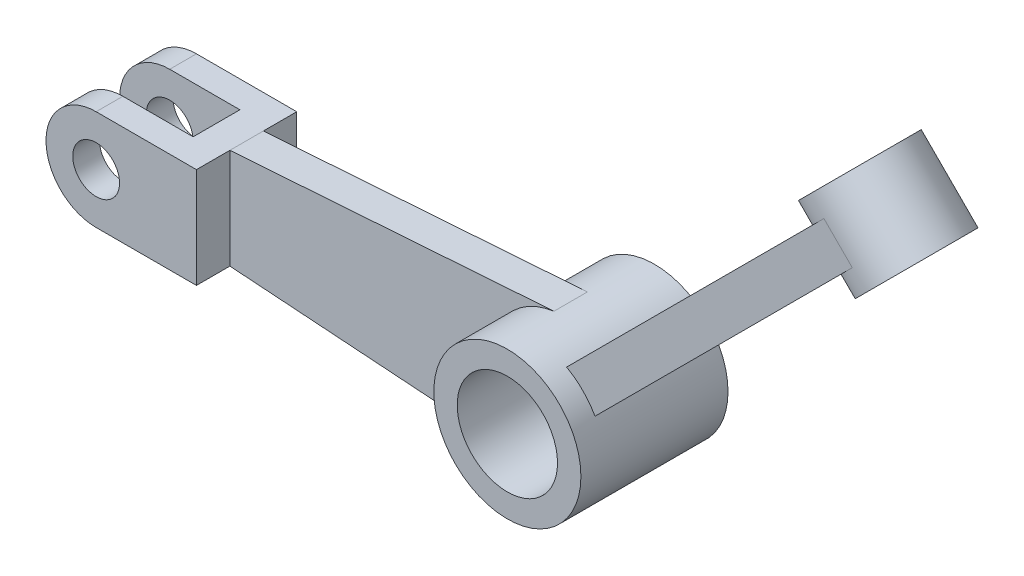
ISO-10303-21;
HEADER;
FILE_DESCRIPTION(('STEP AP214'),'2;1');
FILE_NAME('part.step','',(''),(''),'','','');
FILE_SCHEMA(('AUTOMOTIVE_DESIGN { 1 0 10303 214 1 1 1 1 }'));
ENDSEC;
DATA;
#1=APPLICATION_CONTEXT('core data for automotive mechanical design processes');
#2=APPLICATION_PROTOCOL_DEFINITION('international standard','automotive_design',2000,#1);
#3=PRODUCT_CONTEXT('',#1,'mechanical');
#4=PRODUCT('Part','Part','',(#3));
#5=PRODUCT_RELATED_PRODUCT_CATEGORY('part','',(#4));
#6=PRODUCT_DEFINITION_FORMATION('','',#4);
#7=PRODUCT_DEFINITION_CONTEXT('part definition',#1,'design');
#8=PRODUCT_DEFINITION('design','',#6,#7);
#9=PRODUCT_DEFINITION_SHAPE('','',#8);
#10=(LENGTH_UNIT() NAMED_UNIT(*) SI_UNIT(.MILLI.,.METRE.));
#11=(NAMED_UNIT(*) PLANE_ANGLE_UNIT() SI_UNIT($,.RADIAN.));
#12=(NAMED_UNIT(*) SI_UNIT($,.STERADIAN.) SOLID_ANGLE_UNIT());
#13=UNCERTAINTY_MEASURE_WITH_UNIT(LENGTH_MEASURE(1.E-05),#10,'distance_accuracy_value','');
#14=(GEOMETRIC_REPRESENTATION_CONTEXT(3) GLOBAL_UNCERTAINTY_ASSIGNED_CONTEXT((#13)) GLOBAL_UNIT_ASSIGNED_CONTEXT((#10,
#11,#12)) REPRESENTATION_CONTEXT('',''));
#15=CARTESIAN_POINT('',(0.,0.,0.));
#16=DIRECTION('',(0.,0.,1.));
#17=DIRECTION('',(1.,0.,0.));
#18=AXIS2_PLACEMENT_3D('',#15,#16,#17);
#19=CARTESIAN_POINT('',(-65.,0.,7.5));
#20=DIRECTION('',(0.,0.,-1.));
#21=DIRECTION('',(-1.,0.,0.));
#22=AXIS2_PLACEMENT_3D('',#19,#20,#21);
#23=CYLINDRICAL_SURFACE('',#22,7.5);
#24=DIRECTION('',(0.,0.,-1.));
#25=VECTOR('',#24,1.);
#26=CARTESIAN_POINT('',(-65.,-7.50000000000001,7.5));
#27=LINE('',#26,#25);
#28=CARTESIAN_POINT('',(-65.,-7.50000000000001,-3.5));
#29=VERTEX_POINT('',#28);
#30=CARTESIAN_POINT('',(-65.,-7.50000000000001,-7.5));
#31=VERTEX_POINT('',#30);
#32=EDGE_CURVE('E333',#29,#31,#27,.T.);
#33=ORIENTED_EDGE('',*,*,#32,.F.);
#34=CARTESIAN_POINT('',(-65.,0.,-3.5));
#35=DIRECTION('',(0.,0.,-1.));
#36=DIRECTION('',(-1.,0.,0.));
#37=AXIS2_PLACEMENT_3D('',#34,#35,#36);
#38=CIRCLE('',#37,7.5);
#39=CARTESIAN_POINT('',(-65.,7.49999999999999,-3.5));
#40=VERTEX_POINT('',#39);
#41=EDGE_CURVE('E200',#29,#40,#38,.T.);
#42=ORIENTED_EDGE('',*,*,#41,.T.);
#43=DIRECTION('',(0.,0.,-1.));
#44=VECTOR('',#43,1.);
#45=CARTESIAN_POINT('',(-65.,7.49999999999999,7.5));
#46=LINE('',#45,#44);
#47=CARTESIAN_POINT('',(-65.,7.49999999999999,-7.5));
#48=VERTEX_POINT('',#47);
#49=EDGE_CURVE('E305',#40,#48,#46,.T.);
#50=ORIENTED_EDGE('',*,*,#49,.T.);
#51=CARTESIAN_POINT('',(-65.,0.,-7.5));
#52=DIRECTION('',(0.,0.,1.));
#53=DIRECTION('',(1.,0.,0.));
#54=AXIS2_PLACEMENT_3D('',#51,#52,#53);
#55=CIRCLE('',#54,7.5);
#56=EDGE_CURVE('E287',#48,#31,#55,.T.);
#57=ORIENTED_EDGE('',*,*,#56,.T.);
#58=EDGE_LOOP('',(#33,#42,#50,#57));
#59=FACE_BOUND('',#58,.T.);
#60=ADVANCED_FACE('F41',(#59),#23,.T.);
#61=CARTESIAN_POINT('',(-50.,7.49999999999999,2.5));
#62=DIRECTION('',(-0.069829127699914,0.997558967141627,0.));
#63=DIRECTION('',(-0.997558967141627,-0.069829127699914,0.));
#64=AXIS2_PLACEMENT_3D('',#61,#62,#63);
#65=PLANE('',#64);
#66=DIRECTION('',(0.997558967141627,0.069829127699914,0.));
#67=VECTOR('',#66,1.);
#68=CARTESIAN_POINT('',(-50.,7.49999999999999,2.5));
#69=LINE('',#68,#67);
#70=CARTESIAN_POINT('',(-50.,7.49999999999999,2.5));
#71=VERTEX_POINT('',#70);
#72=CARTESIAN_POINT('',(-1.53249079510398,10.8927256443427,2.5));
#73=VERTEX_POINT('',#72);
#74=EDGE_CURVE('E270',#71,#73,#69,.T.);
#75=ORIENTED_EDGE('',*,*,#74,.T.);
#76=DIRECTION('',(0.,0.,-1.));
#77=VECTOR('',#76,1.);
#78=CARTESIAN_POINT('',(-1.53249079510398,10.8927256443427,11.));
#79=LINE('',#78,#77);
#80=CARTESIAN_POINT('',(-1.53249079510401,10.8927256443427,-2.5));
#81=VERTEX_POINT('',#80);
#82=EDGE_CURVE('E254',#73,#81,#79,.T.);
#83=ORIENTED_EDGE('',*,*,#82,.T.);
#84=DIRECTION('',(0.997558967141627,0.069829127699914,0.));
#85=VECTOR('',#84,1.);
#86=CARTESIAN_POINT('',(-50.,7.49999999999999,-2.5));
#87=LINE('',#86,#85);
#88=CARTESIAN_POINT('',(-50.,7.49999999999999,-2.5));
#89=VERTEX_POINT('',#88);
#90=EDGE_CURVE('E266',#89,#81,#87,.T.);
#91=ORIENTED_EDGE('',*,*,#90,.F.);
#92=DIRECTION('',(0.,0.,-1.));
#93=VECTOR('',#92,1.);
#94=CARTESIAN_POINT('',(-50.,7.49999999999999,2.5));
#95=LINE('',#94,#93);
#96=EDGE_CURVE('E283',#71,#89,#95,.T.);
#97=ORIENTED_EDGE('',*,*,#96,.F.);
#98=EDGE_LOOP('',(#75,#83,#91,#97));
#99=FACE_BOUND('',#98,.T.);
#100=ADVANCED_FACE('F397',(#99),#65,.T.);
#101=CARTESIAN_POINT('',(0.,-11.,2.5));
#102=DIRECTION('',(-0.0698291276999137,-0.997558967141627,0.));
#103=DIRECTION('',(0.997558967141627,-0.0698291276999137,0.));
#104=AXIS2_PLACEMENT_3D('',#101,#102,#103);
#105=PLANE('',#104);
#106=DIRECTION('',(-0.997558967141627,0.0698291276999137,0.));
#107=VECTOR('',#106,1.);
#108=CARTESIAN_POINT('',(0.,-11.,-2.5));
#109=LINE('',#108,#107);
#110=CARTESIAN_POINT('',(-1.532490795104,-10.8927256443427,-2.5));
#111=VERTEX_POINT('',#110);
#112=CARTESIAN_POINT('',(-50.,-7.50000000000001,-2.5));
#113=VERTEX_POINT('',#112);
#114=EDGE_CURVE('E261',#111,#113,#109,.T.);
#115=ORIENTED_EDGE('',*,*,#114,.F.);
#116=DIRECTION('',(0.,0.,-1.));
#117=VECTOR('',#116,1.);
#118=CARTESIAN_POINT('',(-1.53249079510395,-10.8927256443427,11.));
#119=LINE('',#118,#117);
#120=CARTESIAN_POINT('',(-1.53249079510395,-10.8927256443427,2.5));
#121=VERTEX_POINT('',#120);
#122=EDGE_CURVE('E247',#111,#121,#119,.F.);
#123=ORIENTED_EDGE('',*,*,#122,.T.);
#124=DIRECTION('',(-0.997558967141627,0.0698291276999137,0.));
#125=VECTOR('',#124,1.);
#126=CARTESIAN_POINT('',(0.,-11.,2.5));
#127=LINE('',#126,#125);
#128=CARTESIAN_POINT('',(-50.,-7.50000000000001,2.5));
#129=VERTEX_POINT('',#128);
#130=EDGE_CURVE('E262',#121,#129,#127,.T.);
#131=ORIENTED_EDGE('',*,*,#130,.T.);
#132=DIRECTION('',(0.,0.,-1.));
#133=VECTOR('',#132,1.);
#134=CARTESIAN_POINT('',(-50.,-7.50000000000001,2.5));
#135=LINE('',#134,#133);
#136=EDGE_CURVE('E274',#129,#113,#135,.T.);
#137=ORIENTED_EDGE('',*,*,#136,.T.);
#138=EDGE_LOOP('',(#115,#123,#131,#137));
#139=FACE_BOUND('',#138,.T.);
#140=ADVANCED_FACE('F402',(#139),#105,.T.);
#141=CARTESIAN_POINT('',(-50.,7.49999999999999,7.5));
#142=DIRECTION('',(-1.,0.,0.));
#143=DIRECTION('',(0.,-1.,0.));
#144=AXIS2_PLACEMENT_3D('',#141,#142,#143);
#145=PLANE('',#144);
#146=DIRECTION('',(0.,1.,0.));
#147=VECTOR('',#146,1.);
#148=CARTESIAN_POINT('',(-50.,-7.50000000000001,-2.5));
#149=LINE('',#148,#147);
#150=EDGE_CURVE('E277',#113,#89,#149,.T.);
#151=ORIENTED_EDGE('',*,*,#150,.F.);
#152=DIRECTION('',(0.,0.,-1.));
#153=VECTOR('',#152,1.);
#154=CARTESIAN_POINT('',(-50.,-7.50000000000001,7.5));
#155=LINE('',#154,#153);
#156=CARTESIAN_POINT('',(-50.,-7.50000000000001,-7.5));
#157=VERTEX_POINT('',#156);
#158=EDGE_CURVE('E328',#113,#157,#155,.T.);
#159=ORIENTED_EDGE('',*,*,#158,.T.);
#160=DIRECTION('',(0.,1.,0.));
#161=VECTOR('',#160,1.);
#162=CARTESIAN_POINT('',(-50.,7.49999999999999,-7.5));
#163=LINE('',#162,#161);
#164=CARTESIAN_POINT('',(-50.,7.49999999999999,-7.5));
#165=VERTEX_POINT('',#164);
#166=EDGE_CURVE('E313',#157,#165,#163,.T.);
#167=ORIENTED_EDGE('',*,*,#166,.T.);
#168=DIRECTION('',(0.,0.,-1.));
#169=VECTOR('',#168,1.);
#170=CARTESIAN_POINT('',(-50.,7.49999999999999,7.5));
#171=LINE('',#170,#169);
#172=EDGE_CURVE('E323',#89,#165,#171,.T.);
#173=ORIENTED_EDGE('',*,*,#172,.F.);
#174=EDGE_LOOP('',(#151,#159,#167,#173));
#175=FACE_BOUND('',#174,.T.);
#176=ADVANCED_FACE('F408',(#175),#145,.F.);
#177=CARTESIAN_POINT('',(-65.,7.49999999999999,7.5));
#178=VERTEX_POINT('',#177);
#179=CARTESIAN_POINT('',(-65.,7.49999999999999,3.5));
#180=VERTEX_POINT('',#179);
#181=EDGE_CURVE('E320',#178,#180,#46,.T.);
#182=ORIENTED_EDGE('',*,*,#181,.T.);
#183=CARTESIAN_POINT('',(-65.,0.,3.5));
#184=DIRECTION('',(0.,0.,1.));
#185=DIRECTION('',(1.,0.,0.));
#186=AXIS2_PLACEMENT_3D('',#183,#184,#185);
#187=CIRCLE('',#186,7.5);
#188=CARTESIAN_POINT('',(-65.,-7.50000000000001,3.5));
#189=VERTEX_POINT('',#188);
#190=EDGE_CURVE('E59',#180,#189,#187,.T.);
#191=ORIENTED_EDGE('',*,*,#190,.T.);
#192=CARTESIAN_POINT('',(-65.,-7.50000000000001,7.5));
#193=VERTEX_POINT('',#192);
#194=EDGE_CURVE('E334',#193,#189,#27,.T.);
#195=ORIENTED_EDGE('',*,*,#194,.F.);
#196=CARTESIAN_POINT('',(-65.,0.,7.5));
#197=DIRECTION('',(0.,0.,1.));
#198=DIRECTION('',(1.,0.,0.));
#199=AXIS2_PLACEMENT_3D('',#196,#197,#198);
#200=CIRCLE('',#199,7.5);
#201=EDGE_CURVE('E291',#178,#193,#200,.T.);
#202=ORIENTED_EDGE('',*,*,#201,.F.);
#203=EDGE_LOOP('',(#182,#191,#195,#202));
#204=FACE_BOUND('',#203,.T.);
#205=ADVANCED_FACE('F43',(#204),#23,.T.);
#206=CARTESIAN_POINT('',(-65.,-7.50000000000001,7.5));
#207=DIRECTION('',(0.,1.,0.));
#208=DIRECTION('',(0.,0.,1.));
#209=AXIS2_PLACEMENT_3D('',#206,#207,#208);
#210=PLANE('',#209);
#211=DIRECTION('',(0.,0.,-1.));
#212=VECTOR('',#211,1.);
#213=CARTESIAN_POINT('',(-54.5,-7.50000000000001,7.5));
#214=LINE('',#213,#212);
#215=CARTESIAN_POINT('',(-54.5,-7.50000000000001,3.5));
#216=VERTEX_POINT('',#215);
#217=CARTESIAN_POINT('',(-54.5,-7.50000000000001,-3.5));
#218=VERTEX_POINT('',#217);
#219=EDGE_CURVE('E164',#216,#218,#214,.T.);
#220=ORIENTED_EDGE('',*,*,#219,.T.);
#221=DIRECTION('',(-1.,0.,0.));
#222=VECTOR('',#221,1.);
#223=CARTESIAN_POINT('',(-65.,-7.50000000000001,-3.5));
#224=LINE('',#223,#222);
#225=EDGE_CURVE('E196',#218,#29,#224,.T.);
#226=ORIENTED_EDGE('',*,*,#225,.T.);
#227=ORIENTED_EDGE('',*,*,#32,.T.);
#228=DIRECTION('',(1.,0.,0.));
#229=VECTOR('',#228,1.);
#230=CARTESIAN_POINT('',(-65.,-7.50000000000001,-7.5));
#231=LINE('',#230,#229);
#232=EDGE_CURVE('E309',#31,#157,#231,.T.);
#233=ORIENTED_EDGE('',*,*,#232,.T.);
#234=ORIENTED_EDGE('',*,*,#158,.F.);
#235=ORIENTED_EDGE('',*,*,#136,.F.);
#236=CARTESIAN_POINT('',(-50.,-7.50000000000001,7.5));
#237=VERTEX_POINT('',#236);
#238=EDGE_CURVE('E329',#237,#129,#155,.T.);
#239=ORIENTED_EDGE('',*,*,#238,.F.);
#240=DIRECTION('',(1.,0.,0.));
#241=VECTOR('',#240,1.);
#242=CARTESIAN_POINT('',(-65.,-7.50000000000001,7.5));
#243=LINE('',#242,#241);
#244=EDGE_CURVE('E295',#193,#237,#243,.T.);
#245=ORIENTED_EDGE('',*,*,#244,.F.);
#246=ORIENTED_EDGE('',*,*,#194,.T.);
#247=DIRECTION('',(1.,0.,0.));
#248=VECTOR('',#247,1.);
#249=CARTESIAN_POINT('',(-65.,-7.50000000000001,3.5));
#250=LINE('',#249,#248);
#251=EDGE_CURVE('E188',#189,#216,#250,.T.);
#252=ORIENTED_EDGE('',*,*,#251,.T.);
#253=EDGE_LOOP('',(#220,#226,#227,#233,#234,#235,#239,#245,#246,#252));
#254=FACE_BOUND('',#253,.T.);
#255=ADVANCED_FACE('F407',(#254),#210,.F.);
#256=ORIENTED_EDGE('',*,*,#238,.T.);
#257=DIRECTION('',(0.,1.,0.));
#258=VECTOR('',#257,1.);
#259=CARTESIAN_POINT('',(-50.,-7.50000000000001,2.5));
#260=LINE('',#259,#258);
#261=EDGE_CURVE('E265',#129,#71,#260,.T.);
#262=ORIENTED_EDGE('',*,*,#261,.T.);
#263=CARTESIAN_POINT('',(-50.,7.49999999999999,7.5));
#264=VERTEX_POINT('',#263);
#265=EDGE_CURVE('E324',#264,#71,#171,.T.);
#266=ORIENTED_EDGE('',*,*,#265,.F.);
#267=DIRECTION('',(0.,1.,0.));
#268=VECTOR('',#267,1.);
#269=CARTESIAN_POINT('',(-50.,7.49999999999999,7.5));
#270=LINE('',#269,#268);
#271=EDGE_CURVE('E299',#237,#264,#270,.T.);
#272=ORIENTED_EDGE('',*,*,#271,.F.);
#273=EDGE_LOOP('',(#256,#262,#266,#272));
#274=FACE_BOUND('',#273,.T.);
#275=ADVANCED_FACE('F414',(#274),#145,.F.);
#276=CARTESIAN_POINT('',(-65.,7.49999999999999,7.5));
#277=DIRECTION('',(0.,-1.,0.));
#278=DIRECTION('',(0.,0.,-1.));
#279=AXIS2_PLACEMENT_3D('',#276,#277,#278);
#280=PLANE('',#279);
#281=ORIENTED_EDGE('',*,*,#49,.F.);
#282=DIRECTION('',(-1.,0.,0.));
#283=VECTOR('',#282,1.);
#284=CARTESIAN_POINT('',(-54.5,7.49999999999999,-3.5));
#285=LINE('',#284,#283);
#286=CARTESIAN_POINT('',(-54.5,7.49999999999999,-3.5));
#287=VERTEX_POINT('',#286);
#288=EDGE_CURVE('E168',#287,#40,#285,.T.);
#289=ORIENTED_EDGE('',*,*,#288,.F.);
#290=DIRECTION('',(0.,0.,-1.));
#291=VECTOR('',#290,1.);
#292=CARTESIAN_POINT('',(-54.5,7.49999999999999,-3.5));
#293=LINE('',#292,#291);
#294=CARTESIAN_POINT('',(-54.5,7.49999999999999,3.5));
#295=VERTEX_POINT('',#294);
#296=EDGE_CURVE('E161',#295,#287,#293,.T.);
#297=ORIENTED_EDGE('',*,*,#296,.F.);
#298=DIRECTION('',(-1.,0.,0.));
#299=VECTOR('',#298,1.);
#300=CARTESIAN_POINT('',(-65.,7.49999999999999,3.5));
#301=LINE('',#300,#299);
#302=EDGE_CURVE('E11',#295,#180,#301,.T.);
#303=ORIENTED_EDGE('',*,*,#302,.T.);
#304=ORIENTED_EDGE('',*,*,#181,.F.);
#305=DIRECTION('',(-1.,0.,0.));
#306=VECTOR('',#305,1.);
#307=CARTESIAN_POINT('',(-65.,7.49999999999999,7.5));
#308=LINE('',#307,#306);
#309=EDGE_CURVE('E302',#264,#178,#308,.T.);
#310=ORIENTED_EDGE('',*,*,#309,.F.);
#311=ORIENTED_EDGE('',*,*,#265,.T.);
#312=ORIENTED_EDGE('',*,*,#96,.T.);
#313=ORIENTED_EDGE('',*,*,#172,.T.);
#314=DIRECTION('',(-1.,0.,0.));
#315=VECTOR('',#314,1.);
#316=CARTESIAN_POINT('',(-65.,7.49999999999999,-7.5));
#317=LINE('',#316,#315);
#318=EDGE_CURVE('E296',#165,#48,#317,.T.);
#319=ORIENTED_EDGE('',*,*,#318,.T.);
#320=EDGE_LOOP('',(#281,#289,#297,#303,#304,#310,#311,#312,#313,#319));
#321=FACE_BOUND('',#320,.T.);
#322=ADVANCED_FACE('F175',(#321),#280,.F.);
#323=CARTESIAN_POINT('',(-65.,0.,7.5));
#324=DIRECTION('',(0.,0.,1.));
#325=DIRECTION('',(1.,0.,0.));
#326=AXIS2_PLACEMENT_3D('',#323,#324,#325);
#327=PLANE('',#326);
#328=CARTESIAN_POINT('',(-65.,0.,7.5));
#329=DIRECTION('',(0.,0.,1.));
#330=DIRECTION('',(1.,0.,0.));
#331=AXIS2_PLACEMENT_3D('',#328,#329,#330);
#332=CIRCLE('',#331,3.5);
#333=CARTESIAN_POINT('',(-61.5,0.,7.5));
#334=VERTEX_POINT('',#333);
#335=EDGE_CURVE('E177',#334,#334,#332,.T.);
#336=ORIENTED_EDGE('',*,*,#335,.F.);
#337=EDGE_LOOP('',(#336));
#338=FACE_BOUND('',#337,.T.);
#339=ORIENTED_EDGE('',*,*,#201,.T.);
#340=ORIENTED_EDGE('',*,*,#244,.T.);
#341=ORIENTED_EDGE('',*,*,#271,.T.);
#342=ORIENTED_EDGE('',*,*,#309,.T.);
#343=EDGE_LOOP('',(#339,#340,#341,#342));
#344=FACE_BOUND('',#343,.T.);
#345=ADVANCED_FACE('F423',(#338,#344),#327,.T.);
#346=CARTESIAN_POINT('',(-65.,0.,-7.5));
#347=DIRECTION('',(0.,0.,1.));
#348=DIRECTION('',(1.,0.,0.));
#349=AXIS2_PLACEMENT_3D('',#346,#347,#348);
#350=PLANE('',#349);
#351=CARTESIAN_POINT('',(-65.,0.,-7.5));
#352=DIRECTION('',(0.,0.,1.));
#353=DIRECTION('',(1.,0.,0.));
#354=AXIS2_PLACEMENT_3D('',#351,#352,#353);
#355=CIRCLE('',#354,3.5);
#356=CARTESIAN_POINT('',(-61.5,0.,-7.5));
#357=VERTEX_POINT('',#356);
#358=EDGE_CURVE('E183',#357,#357,#355,.T.);
#359=ORIENTED_EDGE('',*,*,#358,.T.);
#360=EDGE_LOOP('',(#359));
#361=FACE_BOUND('',#360,.T.);
#362=ORIENTED_EDGE('',*,*,#56,.F.);
#363=ORIENTED_EDGE('',*,*,#318,.F.);
#364=ORIENTED_EDGE('',*,*,#166,.F.);
#365=ORIENTED_EDGE('',*,*,#232,.F.);
#366=EDGE_LOOP('',(#362,#363,#364,#365));
#367=FACE_BOUND('',#366,.T.);
#368=ADVANCED_FACE('F377',(#361,#367),#350,.F.);
#369=CARTESIAN_POINT('',(0.,0.,2.5));
#370=DIRECTION('',(0.,0.,-1.));
#371=DIRECTION('',(-1.,0.,0.));
#372=AXIS2_PLACEMENT_3D('',#369,#370,#371);
#373=PLANE('',#372);
#374=CARTESIAN_POINT('',(0.,0.,2.5));
#375=DIRECTION('',(0.,0.,-1.));
#376=DIRECTION('',(-1.,0.,0.));
#377=AXIS2_PLACEMENT_3D('',#374,#375,#376);
#378=CIRCLE('',#377,11.);
#379=EDGE_CURVE('E258',#73,#121,#378,.F.);
#380=ORIENTED_EDGE('',*,*,#379,.F.);
#381=ORIENTED_EDGE('',*,*,#74,.F.);
#382=ORIENTED_EDGE('',*,*,#261,.F.);
#383=ORIENTED_EDGE('',*,*,#130,.F.);
#384=EDGE_LOOP('',(#380,#381,#382,#383));
#385=FACE_BOUND('',#384,.T.);
#386=ADVANCED_FACE('F432',(#385),#373,.F.);
#387=CARTESIAN_POINT('',(0.,0.,-2.5));
#388=DIRECTION('',(0.,0.,-1.));
#389=DIRECTION('',(-1.,0.,0.));
#390=AXIS2_PLACEMENT_3D('',#387,#388,#389);
#391=PLANE('',#390);
#392=ORIENTED_EDGE('',*,*,#90,.T.);
#393=CARTESIAN_POINT('',(0.,0.,-2.5));
#394=DIRECTION('',(0.,0.,-1.));
#395=DIRECTION('',(-1.,0.,0.));
#396=AXIS2_PLACEMENT_3D('',#393,#394,#395);
#397=CIRCLE('',#396,11.);
#398=EDGE_CURVE('E338',#81,#111,#397,.F.);
#399=ORIENTED_EDGE('',*,*,#398,.T.);
#400=ORIENTED_EDGE('',*,*,#114,.T.);
#401=ORIENTED_EDGE('',*,*,#150,.T.);
#402=EDGE_LOOP('',(#392,#399,#400,#401));
#403=FACE_BOUND('',#402,.T.);
#404=ADVANCED_FACE('F441',(#403),#391,.T.);
#405=CARTESIAN_POINT('',(0.,0.,11.));
#406=DIRECTION('',(0.,0.,-1.));
#407=DIRECTION('',(-1.,0.,0.));
#408=AXIS2_PLACEMENT_3D('',#405,#406,#407);
#409=CYLINDRICAL_SURFACE('',#408,11.);
#410=DIRECTION('',(0.,0.,-1.));
#411=VECTOR('',#410,1.);
#412=CARTESIAN_POINT('',(9.60463511710751,5.36199442998826,11.));
#413=LINE('',#412,#411);
#414=CARTESIAN_POINT('',(9.60463511710751,5.36199442998826,7.5));
#415=VERTEX_POINT('',#414);
#416=CARTESIAN_POINT('',(9.60463511710751,5.36199442998826,-7.5));
#417=VERTEX_POINT('',#416);
#418=EDGE_CURVE('E66',#415,#417,#413,.T.);
#419=ORIENTED_EDGE('',*,*,#418,.F.);
#420=CARTESIAN_POINT('',(0.,0.,7.5));
#421=DIRECTION('',(0.,0.,1.));
#422=DIRECTION('',(1.,0.,0.));
#423=AXIS2_PLACEMENT_3D('',#420,#421,#422);
#424=CIRCLE('',#423,11.);
#425=CARTESIAN_POINT('',(5.36199442998822,9.60463511710754,7.5));
#426=VERTEX_POINT('',#425);
#427=EDGE_CURVE('E51',#415,#426,#424,.T.);
#428=ORIENTED_EDGE('',*,*,#427,.T.);
#429=DIRECTION('',(0.,0.,-1.));
#430=VECTOR('',#429,1.);
#431=CARTESIAN_POINT('',(5.36199442998822,9.60463511710754,11.));
#432=LINE('',#431,#430);
#433=CARTESIAN_POINT('',(5.36199442998822,9.60463511710754,-7.5));
#434=VERTEX_POINT('',#433);
#435=EDGE_CURVE('E346',#434,#426,#432,.F.);
#436=ORIENTED_EDGE('',*,*,#435,.F.);
#437=CARTESIAN_POINT('',(0.,0.,-7.5));
#438=DIRECTION('',(0.,0.,1.));
#439=DIRECTION('',(1.,0.,0.));
#440=AXIS2_PLACEMENT_3D('',#437,#438,#439);
#441=CIRCLE('',#440,11.);
#442=EDGE_CURVE('E342',#417,#434,#441,.T.);
#443=ORIENTED_EDGE('',*,*,#442,.F.);
#444=EDGE_LOOP('',(#419,#428,#436,#443));
#445=FACE_BOUND('',#444,.T.);
#446=CARTESIAN_POINT('',(0.,0.,11.));
#447=DIRECTION('',(0.,0.,1.));
#448=DIRECTION('',(1.,0.,0.));
#449=AXIS2_PLACEMENT_3D('',#446,#447,#448);
#450=CIRCLE('',#449,11.);
#451=CARTESIAN_POINT('',(11.,0.,11.));
#452=VERTEX_POINT('',#451);
#453=EDGE_CURVE('E243',#452,#452,#450,.T.);
#454=ORIENTED_EDGE('',*,*,#453,.F.);
#455=EDGE_LOOP('',(#454));
#456=FACE_BOUND('',#455,.T.);
#457=CARTESIAN_POINT('',(0.,0.,-11.));
#458=DIRECTION('',(0.,0.,1.));
#459=DIRECTION('',(1.,0.,0.));
#460=AXIS2_PLACEMENT_3D('',#457,#458,#459);
#461=CIRCLE('',#460,11.);
#462=CARTESIAN_POINT('',(11.,0.,-11.));
#463=VERTEX_POINT('',#462);
#464=EDGE_CURVE('E233',#463,#463,#461,.T.);
#465=ORIENTED_EDGE('',*,*,#464,.T.);
#466=EDGE_LOOP('',(#465));
#467=FACE_BOUND('',#466,.T.);
#468=ORIENTED_EDGE('',*,*,#82,.F.);
#469=ORIENTED_EDGE('',*,*,#379,.T.);
#470=ORIENTED_EDGE('',*,*,#122,.F.);
#471=ORIENTED_EDGE('',*,*,#398,.F.);
#472=EDGE_LOOP('',(#468,#469,#470,#471));
#473=FACE_BOUND('',#472,.T.);
#474=ADVANCED_FACE('F443',(#445,#456,#467,#473),#409,.T.);
#475=CARTESIAN_POINT('',(0.,0.,11.));
#476=DIRECTION('',(0.,0.,1.));
#477=DIRECTION('',(1.,0.,0.));
#478=AXIS2_PLACEMENT_3D('',#475,#476,#477);
#479=PLANE('',#478);
#480=CARTESIAN_POINT('',(0.,0.,11.));
#481=DIRECTION('',(0.,0.,1.));
#482=DIRECTION('',(1.,0.,0.));
#483=AXIS2_PLACEMENT_3D('',#480,#481,#482);
#484=CIRCLE('',#483,7.5);
#485=CARTESIAN_POINT('',(7.5,0.,11.));
#486=VERTEX_POINT('',#485);
#487=EDGE_CURVE('E365',#486,#486,#484,.T.);
#488=ORIENTED_EDGE('',*,*,#487,.F.);
#489=EDGE_LOOP('',(#488));
#490=FACE_BOUND('',#489,.T.);
#491=ORIENTED_EDGE('',*,*,#453,.T.);
#492=EDGE_LOOP('',(#491));
#493=FACE_BOUND('',#492,.T.);
#494=ADVANCED_FACE('F445',(#490,#493),#479,.T.);
#495=CARTESIAN_POINT('',(0.,0.,-11.));
#496=DIRECTION('',(0.,0.,1.));
#497=DIRECTION('',(1.,0.,0.));
#498=AXIS2_PLACEMENT_3D('',#495,#496,#497);
#499=PLANE('',#498);
#500=CARTESIAN_POINT('',(0.,0.,-11.));
#501=DIRECTION('',(0.,0.,1.));
#502=DIRECTION('',(1.,0.,0.));
#503=AXIS2_PLACEMENT_3D('',#500,#501,#502);
#504=CIRCLE('',#503,7.5);
#505=CARTESIAN_POINT('',(7.5,0.,-11.));
#506=VERTEX_POINT('',#505);
#507=EDGE_CURVE('E357',#506,#506,#504,.T.);
#508=ORIENTED_EDGE('',*,*,#507,.T.);
#509=EDGE_LOOP('',(#508));
#510=FACE_BOUND('',#509,.T.);
#511=ORIENTED_EDGE('',*,*,#464,.F.);
#512=EDGE_LOOP('',(#511));
#513=FACE_BOUND('',#512,.T.);
#514=ADVANCED_FACE('F451',(#510,#513),#499,.F.);
#515=CARTESIAN_POINT('',(2.12132034355965,-2.12132034355964,7.5));
#516=DIRECTION('',(-0.707106781186549,0.707106781186546,0.));
#517=DIRECTION('',(-0.707106781186546,-0.707106781186549,0.));
#518=AXIS2_PLACEMENT_3D('',#515,#516,#517);
#519=PLANE('',#518);
#520=CARTESIAN_POINT('',(48.0832611206852,43.840620433566,0.));
#521=DIRECTION('',(-0.707106781186549,0.707106781186546,0.));
#522=DIRECTION('',(-0.707106781186546,-0.707106781186549,0.));
#523=AXIS2_PLACEMENT_3D('',#520,#521,#522);
#524=CIRCLE('',#523,7.5);
#525=CARTESIAN_POINT('',(48.0832611206852,43.840620433566,7.5));
#526=VERTEX_POINT('',#525);
#527=CARTESIAN_POINT('',(48.0832611206852,43.840620433566,-7.5));
#528=VERTEX_POINT('',#527);
#529=EDGE_CURVE('E216',#526,#528,#524,.F.);
#530=ORIENTED_EDGE('',*,*,#529,.F.);
#531=DIRECTION('',(0.707106781186546,0.707106781186549,0.));
#532=VECTOR('',#531,1.);
#533=CARTESIAN_POINT('',(2.12132034355965,-2.12132034355964,7.5));
#534=LINE('',#533,#532);
#535=EDGE_CURVE('E221',#415,#526,#534,.T.);
#536=ORIENTED_EDGE('',*,*,#535,.F.);
#537=ORIENTED_EDGE('',*,*,#418,.T.);
#538=DIRECTION('',(0.707106781186546,0.707106781186549,0.));
#539=VECTOR('',#538,1.);
#540=CARTESIAN_POINT('',(2.12132034355965,-2.12132034355964,-7.5));
#541=LINE('',#540,#539);
#542=EDGE_CURVE('E220',#417,#528,#541,.T.);
#543=ORIENTED_EDGE('',*,*,#542,.T.);
#544=EDGE_LOOP('',(#530,#536,#537,#543));
#545=FACE_BOUND('',#544,.T.);
#546=ADVANCED_FACE('F508',(#545),#519,.F.);
#547=CARTESIAN_POINT('',(-2.12132034355965,2.12132034355964,7.5));
#548=DIRECTION('',(0.707106781186549,-0.707106781186546,0.));
#549=DIRECTION('',(0.707106781186546,0.707106781186549,0.));
#550=AXIS2_PLACEMENT_3D('',#547,#548,#549);
#551=PLANE('',#550);
#552=CARTESIAN_POINT('',(43.8406204335659,48.0832611206853,0.));
#553=DIRECTION('',(0.707106781186549,-0.707106781186546,0.));
#554=DIRECTION('',(0.707106781186546,0.707106781186549,0.));
#555=AXIS2_PLACEMENT_3D('',#552,#553,#554);
#556=CIRCLE('',#555,7.5);
#557=CARTESIAN_POINT('',(43.8406204335659,48.0832611206853,-7.5));
#558=VERTEX_POINT('',#557);
#559=CARTESIAN_POINT('',(43.8406204335659,48.0832611206853,7.5));
#560=VERTEX_POINT('',#559);
#561=EDGE_CURVE('E209',#558,#560,#556,.F.);
#562=ORIENTED_EDGE('',*,*,#561,.F.);
#563=DIRECTION('',(-0.707106781186546,-0.707106781186549,0.));
#564=VECTOR('',#563,1.);
#565=CARTESIAN_POINT('',(-2.12132034355965,2.12132034355964,-7.5));
#566=LINE('',#565,#564);
#567=EDGE_CURVE('E226',#558,#434,#566,.T.);
#568=ORIENTED_EDGE('',*,*,#567,.T.);
#569=ORIENTED_EDGE('',*,*,#435,.T.);
#570=DIRECTION('',(-0.707106781186546,-0.707106781186549,0.));
#571=VECTOR('',#570,1.);
#572=CARTESIAN_POINT('',(-2.12132034355965,2.12132034355964,7.5));
#573=LINE('',#572,#571);
#574=EDGE_CURVE('E229',#560,#426,#573,.T.);
#575=ORIENTED_EDGE('',*,*,#574,.F.);
#576=EDGE_LOOP('',(#562,#568,#569,#575));
#577=FACE_BOUND('',#576,.T.);
#578=ADVANCED_FACE('F512',(#577),#551,.F.);
#579=CARTESIAN_POINT('',(0.,0.,7.5));
#580=DIRECTION('',(0.,0.,1.));
#581=DIRECTION('',(1.,0.,0.));
#582=AXIS2_PLACEMENT_3D('',#579,#580,#581);
#583=PLANE('',#582);
#584=ORIENTED_EDGE('',*,*,#427,.F.);
#585=ORIENTED_EDGE('',*,*,#535,.T.);
#586=DIRECTION('',(-0.707106781186549,0.707106781186546,0.));
#587=VECTOR('',#586,1.);
#588=CARTESIAN_POINT('',(43.8406204335659,48.0832611206853,7.5));
#589=LINE('',#588,#587);
#590=EDGE_CURVE('E225',#526,#560,#589,.T.);
#591=ORIENTED_EDGE('',*,*,#590,.T.);
#592=ORIENTED_EDGE('',*,*,#574,.T.);
#593=EDGE_LOOP('',(#584,#585,#591,#592));
#594=FACE_BOUND('',#593,.T.);
#595=ADVANCED_FACE('F523',(#594),#583,.T.);
#596=CARTESIAN_POINT('',(0.,0.,-7.5));
#597=DIRECTION('',(0.,0.,1.));
#598=DIRECTION('',(1.,0.,0.));
#599=AXIS2_PLACEMENT_3D('',#596,#597,#598);
#600=PLANE('',#599);
#601=ORIENTED_EDGE('',*,*,#542,.F.);
#602=ORIENTED_EDGE('',*,*,#442,.T.);
#603=ORIENTED_EDGE('',*,*,#567,.F.);
#604=DIRECTION('',(-0.707106781186549,0.707106781186546,0.));
#605=VECTOR('',#604,1.);
#606=CARTESIAN_POINT('',(43.8406204335659,48.0832611206853,-7.5));
#607=LINE('',#606,#605);
#608=EDGE_CURVE('E236',#528,#558,#607,.T.);
#609=ORIENTED_EDGE('',*,*,#608,.F.);
#610=EDGE_LOOP('',(#601,#602,#603,#609));
#611=FACE_BOUND('',#610,.T.);
#612=ADVANCED_FACE('F533',(#611),#600,.F.);
#613=CARTESIAN_POINT('',(41.7193000900062,50.204581464245,0.));
#614=DIRECTION('',(0.707106781186549,-0.707106781186546,0.));
#615=DIRECTION('',(0.707106781186546,0.707106781186549,0.));
#616=AXIS2_PLACEMENT_3D('',#613,#614,#615);
#617=CYLINDRICAL_SURFACE('',#616,7.5);
#618=ORIENTED_EDGE('',*,*,#590,.F.);
#619=ORIENTED_EDGE('',*,*,#529,.T.);
#620=ORIENTED_EDGE('',*,*,#608,.T.);
#621=ORIENTED_EDGE('',*,*,#561,.T.);
#622=EDGE_LOOP('',(#618,#619,#620,#621));
#623=FACE_BOUND('',#622,.T.);
#624=CARTESIAN_POINT('',(41.7193000900062,50.204581464245,0.));
#625=DIRECTION('',(-0.707106781186549,0.707106781186546,0.));
#626=DIRECTION('',(-0.707106781186546,-0.707106781186549,0.));
#627=AXIS2_PLACEMENT_3D('',#624,#625,#626);
#628=CIRCLE('',#627,7.5);
#629=CARTESIAN_POINT('',(36.4159992311071,44.9012806053458,0.));
#630=VERTEX_POINT('',#629);
#631=EDGE_CURVE('E205',#630,#630,#628,.T.);
#632=ORIENTED_EDGE('',*,*,#631,.F.);
#633=EDGE_LOOP('',(#632));
#634=FACE_BOUND('',#633,.T.);
#635=CARTESIAN_POINT('',(50.2045814642448,41.7193000900064,0.));
#636=DIRECTION('',(-0.707106781186549,0.707106781186546,0.));
#637=DIRECTION('',(-0.707106781186546,-0.707106781186549,0.));
#638=AXIS2_PLACEMENT_3D('',#635,#636,#637);
#639=CIRCLE('',#638,7.5);
#640=CARTESIAN_POINT('',(44.9012806053457,36.4159992311073,0.));
#641=VERTEX_POINT('',#640);
#642=EDGE_CURVE('E204',#641,#641,#639,.T.);
#643=ORIENTED_EDGE('',*,*,#642,.T.);
#644=EDGE_LOOP('',(#643));
#645=FACE_BOUND('',#644,.T.);
#646=ADVANCED_FACE('F543',(#623,#634,#645),#617,.T.);
#647=CARTESIAN_POINT('',(41.7193000900062,50.204581464245,0.));
#648=DIRECTION('',(-0.707106781186549,0.707106781186546,0.));
#649=DIRECTION('',(-0.707106781186546,-0.707106781186549,0.));
#650=AXIS2_PLACEMENT_3D('',#647,#648,#649);
#651=PLANE('',#650);
#652=CARTESIAN_POINT('',(41.7193000900062,50.204581464245,0.));
#653=DIRECTION('',(-0.707106781186549,0.707106781186546,0.));
#654=DIRECTION('',(-0.707106781186546,-0.707106781186549,0.));
#655=AXIS2_PLACEMENT_3D('',#652,#653,#654);
#656=CIRCLE('',#655,3.5);
#657=CARTESIAN_POINT('',(39.2444263558533,47.729707730092,0.));
#658=VERTEX_POINT('',#657);
#659=EDGE_CURVE('E657',#658,#658,#656,.T.);
#660=ORIENTED_EDGE('',*,*,#659,.F.);
#661=EDGE_LOOP('',(#660));
#662=FACE_BOUND('',#661,.T.);
#663=ORIENTED_EDGE('',*,*,#631,.T.);
#664=EDGE_LOOP('',(#663));
#665=FACE_BOUND('',#664,.T.);
#666=ADVANCED_FACE('F552',(#662,#665),#651,.T.);
#667=CARTESIAN_POINT('',(50.2045814642448,41.7193000900064,0.));
#668=DIRECTION('',(-0.707106781186549,0.707106781186546,0.));
#669=DIRECTION('',(-0.707106781186546,-0.707106781186549,0.));
#670=AXIS2_PLACEMENT_3D('',#667,#668,#669);
#671=PLANE('',#670);
#672=CARTESIAN_POINT('',(50.2045814642448,41.7193000900064,0.));
#673=DIRECTION('',(-0.707106781186549,0.707106781186546,0.));
#674=DIRECTION('',(-0.707106781186546,-0.707106781186549,0.));
#675=AXIS2_PLACEMENT_3D('',#672,#673,#674);
#676=CIRCLE('',#675,3.5);
#677=CARTESIAN_POINT('',(47.7297077300919,39.2444263558535,0.));
#678=VERTEX_POINT('',#677);
#679=EDGE_CURVE('E45',#678,#678,#676,.T.);
#680=ORIENTED_EDGE('',*,*,#679,.T.);
#681=EDGE_LOOP('',(#680));
#682=FACE_BOUND('',#681,.T.);
#683=ORIENTED_EDGE('',*,*,#642,.F.);
#684=EDGE_LOOP('',(#683));
#685=FACE_BOUND('',#684,.T.);
#686=ADVANCED_FACE('F633',(#682,#685),#671,.F.);
#687=CARTESIAN_POINT('',(-54.5,-11.,-3.5));
#688=DIRECTION('',(0.,0.,-1.));
#689=DIRECTION('',(-1.,0.,0.));
#690=AXIS2_PLACEMENT_3D('',#687,#688,#689);
#691=PLANE('',#690);
#692=CARTESIAN_POINT('',(-65.,0.,-3.5));
#693=DIRECTION('',(0.,0.,-1.));
#694=DIRECTION('',(-1.,0.,0.));
#695=AXIS2_PLACEMENT_3D('',#692,#693,#694);
#696=CIRCLE('',#695,3.5);
#697=CARTESIAN_POINT('',(-68.5,0.,-3.5));
#698=VERTEX_POINT('',#697);
#699=EDGE_CURVE('E356',#698,#698,#696,.T.);
#700=ORIENTED_EDGE('',*,*,#699,.T.);
#701=EDGE_LOOP('',(#700));
#702=FACE_BOUND('',#701,.T.);
#703=ORIENTED_EDGE('',*,*,#225,.F.);
#704=DIRECTION('',(0.,1.,0.));
#705=VECTOR('',#704,1.);
#706=CARTESIAN_POINT('',(-54.5,-11.,-3.5));
#707=LINE('',#706,#705);
#708=EDGE_CURVE('E167',#218,#287,#707,.T.);
#709=ORIENTED_EDGE('',*,*,#708,.T.);
#710=ORIENTED_EDGE('',*,*,#288,.T.);
#711=ORIENTED_EDGE('',*,*,#41,.F.);
#712=EDGE_LOOP('',(#703,#709,#710,#711));
#713=FACE_BOUND('',#712,.T.);
#714=ADVANCED_FACE('F630',(#702,#713),#691,.F.);
#715=CARTESIAN_POINT('',(-54.5,-11.,-3.5));
#716=DIRECTION('',(1.,0.,0.));
#717=DIRECTION('',(0.,0.,-1.));
#718=AXIS2_PLACEMENT_3D('',#715,#716,#717);
#719=PLANE('',#718);
#720=DIRECTION('',(0.,1.,0.));
#721=VECTOR('',#720,1.);
#722=CARTESIAN_POINT('',(-54.5,-11.,3.5));
#723=LINE('',#722,#721);
#724=EDGE_CURVE('E157',#216,#295,#723,.T.);
#725=ORIENTED_EDGE('',*,*,#724,.T.);
#726=ORIENTED_EDGE('',*,*,#296,.T.);
#727=ORIENTED_EDGE('',*,*,#708,.F.);
#728=ORIENTED_EDGE('',*,*,#219,.F.);
#729=EDGE_LOOP('',(#725,#726,#727,#728));
#730=FACE_BOUND('',#729,.T.);
#731=ADVANCED_FACE('F158',(#730),#719,.F.);
#732=CARTESIAN_POINT('',(-54.5,-11.,3.5));
#733=DIRECTION('',(0.,0.,1.));
#734=DIRECTION('',(1.,0.,0.));
#735=AXIS2_PLACEMENT_3D('',#732,#733,#734);
#736=PLANE('',#735);
#737=CARTESIAN_POINT('',(-65.,0.,3.5));
#738=DIRECTION('',(0.,0.,1.));
#739=DIRECTION('',(1.,0.,0.));
#740=AXIS2_PLACEMENT_3D('',#737,#738,#739);
#741=CIRCLE('',#740,3.5);
#742=CARTESIAN_POINT('',(-61.5,0.,3.5));
#743=VERTEX_POINT('',#742);
#744=EDGE_CURVE('E353',#743,#743,#741,.T.);
#745=ORIENTED_EDGE('',*,*,#744,.T.);
#746=EDGE_LOOP('',(#745));
#747=FACE_BOUND('',#746,.T.);
#748=ORIENTED_EDGE('',*,*,#302,.F.);
#749=ORIENTED_EDGE('',*,*,#724,.F.);
#750=ORIENTED_EDGE('',*,*,#251,.F.);
#751=ORIENTED_EDGE('',*,*,#190,.F.);
#752=EDGE_LOOP('',(#748,#749,#750,#751));
#753=FACE_BOUND('',#752,.T.);
#754=ADVANCED_FACE('F170',(#747,#753),#736,.F.);
#755=CARTESIAN_POINT('',(-65.,0.,-11.));
#756=DIRECTION('',(0.,0.,1.));
#757=DIRECTION('',(1.,0.,0.));
#758=AXIS2_PLACEMENT_3D('',#755,#756,#757);
#759=CYLINDRICAL_SURFACE('',#758,3.5);
#760=ORIENTED_EDGE('',*,*,#335,.T.);
#761=EDGE_LOOP('',(#760));
#762=FACE_BOUND('',#761,.T.);
#763=ORIENTED_EDGE('',*,*,#744,.F.);
#764=EDGE_LOOP('',(#763));
#765=FACE_BOUND('',#764,.T.);
#766=ADVANCED_FACE('F383',(#762,#765),#759,.F.);
#767=ORIENTED_EDGE('',*,*,#699,.F.);
#768=EDGE_LOOP('',(#767));
#769=FACE_BOUND('',#768,.T.);
#770=ORIENTED_EDGE('',*,*,#358,.F.);
#771=EDGE_LOOP('',(#770));
#772=FACE_BOUND('',#771,.T.);
#773=ADVANCED_FACE('F380',(#769,#772),#759,.F.);
#774=CARTESIAN_POINT('',(0.,0.,-11.));
#775=DIRECTION('',(0.,0.,1.));
#776=DIRECTION('',(1.,0.,0.));
#777=AXIS2_PLACEMENT_3D('',#774,#775,#776);
#778=CYLINDRICAL_SURFACE('',#777,7.5);
#779=ORIENTED_EDGE('',*,*,#507,.F.);
#780=EDGE_LOOP('',(#779));
#781=FACE_BOUND('',#780,.T.);
#782=ORIENTED_EDGE('',*,*,#487,.T.);
#783=EDGE_LOOP('',(#782));
#784=FACE_BOUND('',#783,.T.);
#785=ADVANCED_FACE('F382',(#781,#784),#778,.F.);
#786=CARTESIAN_POINT('',(79.2158819386976,12.7079996155537,0.));
#787=DIRECTION('',(-0.707106781186549,0.707106781186546,0.));
#788=DIRECTION('',(-0.707106781186546,-0.707106781186549,0.));
#789=AXIS2_PLACEMENT_3D('',#786,#787,#788);
#790=CYLINDRICAL_SURFACE('',#789,3.5);
#791=ORIENTED_EDGE('',*,*,#659,.T.);
#792=EDGE_LOOP('',(#791));
#793=FACE_BOUND('',#792,.T.);
#794=ORIENTED_EDGE('',*,*,#679,.F.);
#795=EDGE_LOOP('',(#794));
#796=FACE_BOUND('',#795,.T.);
#797=ADVANCED_FACE('F390',(#793,#796),#790,.F.);
#798=CLOSED_SHELL('',(#60,#100,#140,#176,#205,#255,#275,#322,#345,#368,#386,#404,#474,#494,#514,
#546,#578,#595,#612,#646,#666,#686,#714,#731,#754,#766,#773,#785,#797));
#799=MANIFOLD_SOLID_BREP('B2',#798);
#800=ADVANCED_BREP_SHAPE_REPRESENTATION('',(#18,#799),#14);
#801=SHAPE_DEFINITION_REPRESENTATION(#9,#800);
ENDSEC;
END-ISO-10303-21;
